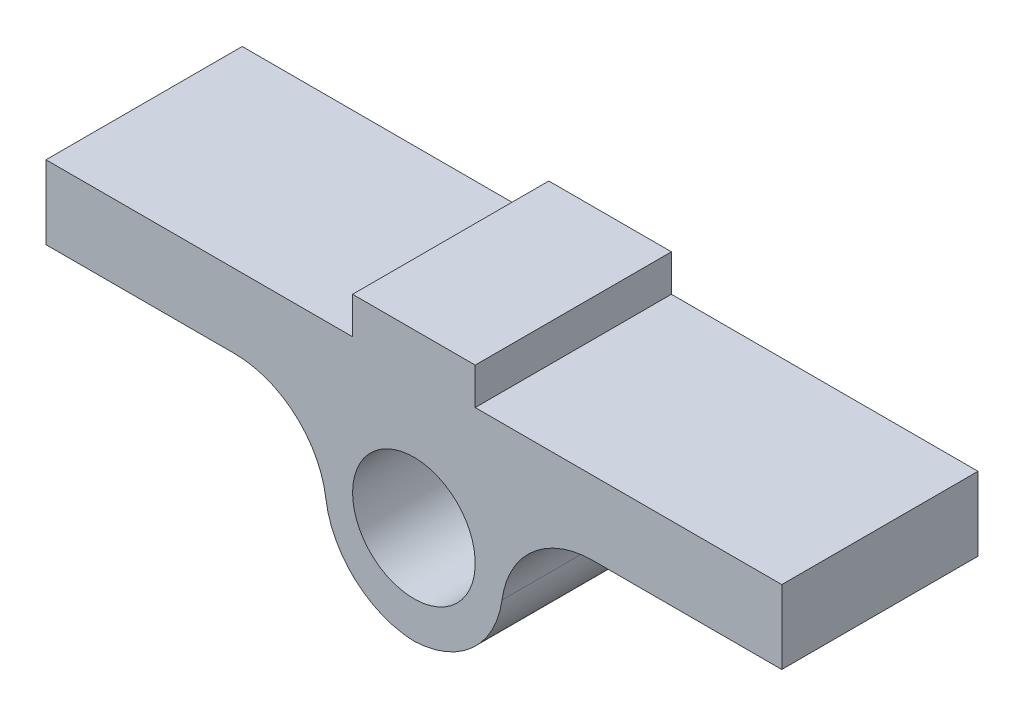
ISO-10303-21;
HEADER;
FILE_DESCRIPTION(('STEP AP214'),'2;1');
FILE_NAME('part.step','',(''),(''),'','','');
FILE_SCHEMA(('AUTOMOTIVE_DESIGN { 1 0 10303 214 1 1 1 1 }'));
ENDSEC;
DATA;
#1=APPLICATION_CONTEXT('core data for automotive mechanical design processes');
#2=APPLICATION_PROTOCOL_DEFINITION('international standard','automotive_design',2000,#1);
#3=PRODUCT_CONTEXT('',#1,'mechanical');
#4=PRODUCT('Part','Part','',(#3));
#5=PRODUCT_RELATED_PRODUCT_CATEGORY('part','',(#4));
#6=PRODUCT_DEFINITION_FORMATION('','',#4);
#7=PRODUCT_DEFINITION_CONTEXT('part definition',#1,'design');
#8=PRODUCT_DEFINITION('design','',#6,#7);
#9=PRODUCT_DEFINITION_SHAPE('','',#8);
#10=(LENGTH_UNIT() NAMED_UNIT(*) SI_UNIT(.MILLI.,.METRE.));
#11=(NAMED_UNIT(*) PLANE_ANGLE_UNIT() SI_UNIT($,.RADIAN.));
#12=(NAMED_UNIT(*) SI_UNIT($,.STERADIAN.) SOLID_ANGLE_UNIT());
#13=UNCERTAINTY_MEASURE_WITH_UNIT(LENGTH_MEASURE(1.E-05),#10,'distance_accuracy_value','');
#14=(GEOMETRIC_REPRESENTATION_CONTEXT(3) GLOBAL_UNCERTAINTY_ASSIGNED_CONTEXT((#13)) GLOBAL_UNIT_ASSIGNED_CONTEXT((#10,
#11,#12)) REPRESENTATION_CONTEXT('',''));
#15=CARTESIAN_POINT('',(0.,0.,0.));
#16=DIRECTION('',(0.,0.,1.));
#17=DIRECTION('',(1.,0.,0.));
#18=AXIS2_PLACEMENT_3D('',#15,#16,#17);
#19=CARTESIAN_POINT('',(0.,0.,0.));
#20=DIRECTION('',(0.,-1.,0.));
#21=DIRECTION('',(0.,0.,-1.));
#22=AXIS2_PLACEMENT_3D('',#19,#20,#21);
#23=PLANE('',#22);
#24=DIRECTION('',(-1.,0.,0.));
#25=VECTOR('',#24,1.);
#26=CARTESIAN_POINT('',(0.,0.,-16.));
#27=LINE('',#26,#25);
#28=CARTESIAN_POINT('',(15.3839312526815,0.,-16.));
#29=VERTEX_POINT('',#28);
#30=CARTESIAN_POINT('',(0.,0.,-16.));
#31=VERTEX_POINT('',#30);
#32=EDGE_CURVE('E182',#29,#31,#27,.T.);
#33=ORIENTED_EDGE('',*,*,#32,.F.);
#34=DIRECTION('',(0.,0.,-1.));
#35=VECTOR('',#34,1.);
#36=CARTESIAN_POINT('',(15.3839312526815,0.,0.));
#37=LINE('',#36,#35);
#38=CARTESIAN_POINT('',(15.3839312526815,0.,0.));
#39=VERTEX_POINT('',#38);
#40=EDGE_CURVE('E211',#29,#39,#37,.F.);
#41=ORIENTED_EDGE('',*,*,#40,.T.);
#42=DIRECTION('',(1.,0.,0.));
#43=VECTOR('',#42,1.);
#44=CARTESIAN_POINT('',(0.,0.,0.));
#45=LINE('',#44,#43);
#46=CARTESIAN_POINT('',(0.,0.,0.));
#47=VERTEX_POINT('',#46);
#48=EDGE_CURVE('E178',#47,#39,#45,.T.);
#49=ORIENTED_EDGE('',*,*,#48,.F.);
#50=DIRECTION('',(0.,0.,1.));
#51=VECTOR('',#50,1.);
#52=CARTESIAN_POINT('',(0.,0.,0.));
#53=LINE('',#52,#51);
#54=EDGE_CURVE('E156',#31,#47,#53,.T.);
#55=ORIENTED_EDGE('',*,*,#54,.F.);
#56=EDGE_LOOP('',(#33,#41,#49,#55));
#57=FACE_BOUND('',#56,.T.);
#58=ADVANCED_FACE('F37',(#57),#23,.T.);
#59=CARTESIAN_POINT('',(0.,6.,0.));
#60=DIRECTION('',(0.,-1.,0.));
#61=DIRECTION('',(0.,0.,-1.));
#62=AXIS2_PLACEMENT_3D('',#59,#60,#61);
#63=PLANE('',#62);
#64=DIRECTION('',(0.,0.,1.));
#65=VECTOR('',#64,1.);
#66=CARTESIAN_POINT('',(25.,6.,-16.));
#67=LINE('',#66,#65);
#68=CARTESIAN_POINT('',(25.,6.,-16.));
#69=VERTEX_POINT('',#68);
#70=CARTESIAN_POINT('',(25.,6.,0.));
#71=VERTEX_POINT('',#70);
#72=EDGE_CURVE('E155',#69,#71,#67,.T.);
#73=ORIENTED_EDGE('',*,*,#72,.F.);
#74=DIRECTION('',(-1.,0.,0.));
#75=VECTOR('',#74,1.);
#76=CARTESIAN_POINT('',(0.,6.,-16.));
#77=LINE('',#76,#75);
#78=CARTESIAN_POINT('',(0.,6.,-16.));
#79=VERTEX_POINT('',#78);
#80=EDGE_CURVE('E174',#69,#79,#77,.T.);
#81=ORIENTED_EDGE('',*,*,#80,.T.);
#82=DIRECTION('',(0.,0.,1.));
#83=VECTOR('',#82,1.);
#84=CARTESIAN_POINT('',(0.,6.,0.));
#85=LINE('',#84,#83);
#86=CARTESIAN_POINT('',(0.,6.,0.));
#87=VERTEX_POINT('',#86);
#88=EDGE_CURVE('E165',#79,#87,#85,.T.);
#89=ORIENTED_EDGE('',*,*,#88,.T.);
#90=DIRECTION('',(1.,0.,0.));
#91=VECTOR('',#90,1.);
#92=CARTESIAN_POINT('',(0.,6.,0.));
#93=LINE('',#92,#91);
#94=EDGE_CURVE('E170',#87,#71,#93,.T.);
#95=ORIENTED_EDGE('',*,*,#94,.T.);
#96=EDGE_LOOP('',(#73,#81,#89,#95));
#97=FACE_BOUND('',#96,.T.);
#98=ADVANCED_FACE('F278',(#97),#63,.F.);
#99=DIRECTION('',(0.,0.,-1.));
#100=VECTOR('',#99,1.);
#101=CARTESIAN_POINT('',(35.,6.,-16.));
#102=LINE('',#101,#100);
#103=CARTESIAN_POINT('',(35.,6.,0.));
#104=VERTEX_POINT('',#103);
#105=CARTESIAN_POINT('',(35.,6.,-16.));
#106=VERTEX_POINT('',#105);
#107=EDGE_CURVE('E152',#104,#106,#102,.T.);
#108=ORIENTED_EDGE('',*,*,#107,.F.);
#109=CARTESIAN_POINT('',(60.,6.,0.));
#110=VERTEX_POINT('',#109);
#111=EDGE_CURVE('E168',#104,#110,#93,.T.);
#112=ORIENTED_EDGE('',*,*,#111,.T.);
#113=DIRECTION('',(0.,0.,-1.));
#114=VECTOR('',#113,1.);
#115=CARTESIAN_POINT('',(60.,6.,0.));
#116=LINE('',#115,#114);
#117=CARTESIAN_POINT('',(60.,6.,-16.));
#118=VERTEX_POINT('',#117);
#119=EDGE_CURVE('E172',#110,#118,#116,.T.);
#120=ORIENTED_EDGE('',*,*,#119,.T.);
#121=EDGE_CURVE('E175',#118,#106,#77,.T.);
#122=ORIENTED_EDGE('',*,*,#121,.T.);
#123=EDGE_LOOP('',(#108,#112,#120,#122));
#124=FACE_BOUND('',#123,.T.);
#125=ADVANCED_FACE('F282',(#124),#63,.F.);
#126=CARTESIAN_POINT('',(0.,6.,0.));
#127=DIRECTION('',(1.,0.,0.));
#128=DIRECTION('',(0.,0.,-1.));
#129=AXIS2_PLACEMENT_3D('',#126,#127,#128);
#130=PLANE('',#129);
#131=ORIENTED_EDGE('',*,*,#54,.T.);
#132=DIRECTION('',(0.,-1.,0.));
#133=VECTOR('',#132,1.);
#134=CARTESIAN_POINT('',(0.,6.,0.));
#135=LINE('',#134,#133);
#136=EDGE_CURVE('E192',#87,#47,#135,.T.);
#137=ORIENTED_EDGE('',*,*,#136,.F.);
#138=ORIENTED_EDGE('',*,*,#88,.F.);
#139=DIRECTION('',(0.,-1.,0.));
#140=VECTOR('',#139,1.);
#141=CARTESIAN_POINT('',(0.,6.,-16.));
#142=LINE('',#141,#140);
#143=EDGE_CURVE('E176',#79,#31,#142,.T.);
#144=ORIENTED_EDGE('',*,*,#143,.T.);
#145=EDGE_LOOP('',(#131,#137,#138,#144));
#146=FACE_BOUND('',#145,.T.);
#147=ADVANCED_FACE('F239',(#146),#130,.F.);
#148=CARTESIAN_POINT('',(0.,6.,0.));
#149=DIRECTION('',(0.,0.,-1.));
#150=DIRECTION('',(-1.,0.,0.));
#151=AXIS2_PLACEMENT_3D('',#148,#149,#150);
#152=PLANE('',#151);
#153=CARTESIAN_POINT('',(30.,-5.,0.));
#154=DIRECTION('',(0.,0.,-1.));
#155=DIRECTION('',(-1.,0.,0.));
#156=AXIS2_PLACEMENT_3D('',#153,#154,#155);
#157=CIRCLE('',#156,5.);
#158=CARTESIAN_POINT('',(25.,-5.,0.));
#159=VERTEX_POINT('',#158);
#160=EDGE_CURVE('E250',#159,#159,#157,.T.);
#161=ORIENTED_EDGE('',*,*,#160,.T.);
#162=EDGE_LOOP('',(#161));
#163=FACE_BOUND('',#162,.T.);
#164=ORIENTED_EDGE('',*,*,#48,.T.);
#165=CARTESIAN_POINT('',(15.3839312526815,-7.5,0.));
#166=DIRECTION('',(0.,0.,-1.));
#167=DIRECTION('',(-1.,0.,0.));
#168=AXIS2_PLACEMENT_3D('',#165,#166,#167);
#169=CIRCLE('',#168,7.5);
#170=CARTESIAN_POINT('',(22.8169656263407,-6.5,0.));
#171=VERTEX_POINT('',#170);
#172=EDGE_CURVE('E219',#39,#171,#169,.T.);
#173=ORIENTED_EDGE('',*,*,#172,.T.);
#174=CARTESIAN_POINT('',(30.25,-5.5,0.));
#175=DIRECTION('',(0.,0.,-1.));
#176=DIRECTION('',(-1.,0.,0.));
#177=AXIS2_PLACEMENT_3D('',#174,#175,#176);
#178=CIRCLE('',#177,7.5);
#179=CARTESIAN_POINT('',(30.,-12.9958321752825,0.));
#180=VERTEX_POINT('',#179);
#181=EDGE_CURVE('E202',#171,#180,#178,.F.);
#182=ORIENTED_EDGE('',*,*,#181,.T.);
#183=CARTESIAN_POINT('',(29.75,-5.5,0.));
#184=DIRECTION('',(0.,0.,-1.));
#185=DIRECTION('',(-1.,0.,0.));
#186=AXIS2_PLACEMENT_3D('',#183,#184,#185);
#187=CIRCLE('',#186,7.5);
#188=CARTESIAN_POINT('',(37.1830343736593,-6.5,0.));
#189=VERTEX_POINT('',#188);
#190=EDGE_CURVE('E200',#180,#189,#187,.F.);
#191=ORIENTED_EDGE('',*,*,#190,.T.);
#192=CARTESIAN_POINT('',(44.6160687473185,-7.5,0.));
#193=DIRECTION('',(0.,0.,-1.));
#194=DIRECTION('',(-1.,0.,0.));
#195=AXIS2_PLACEMENT_3D('',#192,#193,#194);
#196=CIRCLE('',#195,7.5);
#197=CARTESIAN_POINT('',(44.6160687473185,0.,0.));
#198=VERTEX_POINT('',#197);
#199=EDGE_CURVE('E45',#189,#198,#196,.T.);
#200=ORIENTED_EDGE('',*,*,#199,.T.);
#201=CARTESIAN_POINT('',(60.,0.,0.));
#202=VERTEX_POINT('',#201);
#203=EDGE_CURVE('E159',#198,#202,#45,.T.);
#204=ORIENTED_EDGE('',*,*,#203,.T.);
#205=DIRECTION('',(0.,-1.,0.));
#206=VECTOR('',#205,1.);
#207=CARTESIAN_POINT('',(60.,6.,0.));
#208=LINE('',#207,#206);
#209=EDGE_CURVE('E189',#110,#202,#208,.T.);
#210=ORIENTED_EDGE('',*,*,#209,.F.);
#211=ORIENTED_EDGE('',*,*,#111,.F.);
#212=DIRECTION('',(0.,-1.,0.));
#213=VECTOR('',#212,1.);
#214=CARTESIAN_POINT('',(35.,9.,0.));
#215=LINE('',#214,#213);
#216=CARTESIAN_POINT('',(35.,9.,0.));
#217=VERTEX_POINT('',#216);
#218=EDGE_CURVE('E139',#217,#104,#215,.T.);
#219=ORIENTED_EDGE('',*,*,#218,.F.);
#220=DIRECTION('',(1.,0.,0.));
#221=VECTOR('',#220,1.);
#222=CARTESIAN_POINT('',(25.,9.,0.));
#223=LINE('',#222,#221);
#224=CARTESIAN_POINT('',(25.,9.,0.));
#225=VERTEX_POINT('',#224);
#226=EDGE_CURVE('E130',#225,#217,#223,.T.);
#227=ORIENTED_EDGE('',*,*,#226,.F.);
#228=DIRECTION('',(0.,-1.,0.));
#229=VECTOR('',#228,1.);
#230=CARTESIAN_POINT('',(25.,9.,0.));
#231=LINE('',#230,#229);
#232=EDGE_CURVE('E135',#225,#71,#231,.T.);
#233=ORIENTED_EDGE('',*,*,#232,.T.);
#234=ORIENTED_EDGE('',*,*,#94,.F.);
#235=ORIENTED_EDGE('',*,*,#136,.T.);
#236=EDGE_LOOP('',(#164,#173,#182,#191,#200,#204,#210,#211,#219,#227,#233,#234,#235));
#237=FACE_BOUND('',#236,.T.);
#238=ADVANCED_FACE('F133',(#163,#237),#152,.F.);
#239=CARTESIAN_POINT('',(60.,6.,0.));
#240=DIRECTION('',(-1.,0.,0.));
#241=DIRECTION('',(0.,0.,1.));
#242=AXIS2_PLACEMENT_3D('',#239,#240,#241);
#243=PLANE('',#242);
#244=DIRECTION('',(0.,0.,-1.));
#245=VECTOR('',#244,1.);
#246=CARTESIAN_POINT('',(60.,0.,0.));
#247=LINE('',#246,#245);
#248=CARTESIAN_POINT('',(60.,0.,-16.));
#249=VERTEX_POINT('',#248);
#250=EDGE_CURVE('E180',#202,#249,#247,.T.);
#251=ORIENTED_EDGE('',*,*,#250,.T.);
#252=DIRECTION('',(0.,-1.,0.));
#253=VECTOR('',#252,1.);
#254=CARTESIAN_POINT('',(60.,6.,-16.));
#255=LINE('',#254,#253);
#256=EDGE_CURVE('E186',#118,#249,#255,.T.);
#257=ORIENTED_EDGE('',*,*,#256,.F.);
#258=ORIENTED_EDGE('',*,*,#119,.F.);
#259=ORIENTED_EDGE('',*,*,#209,.T.);
#260=EDGE_LOOP('',(#251,#257,#258,#259));
#261=FACE_BOUND('',#260,.T.);
#262=ADVANCED_FACE('F268',(#261),#243,.F.);
#263=CARTESIAN_POINT('',(0.,6.,-16.));
#264=DIRECTION('',(0.,0.,1.));
#265=DIRECTION('',(1.,0.,0.));
#266=AXIS2_PLACEMENT_3D('',#263,#264,#265);
#267=PLANE('',#266);
#268=CARTESIAN_POINT('',(30.,-5.,-16.));
#269=DIRECTION('',(0.,0.,-1.));
#270=DIRECTION('',(-1.,0.,0.));
#271=AXIS2_PLACEMENT_3D('',#268,#269,#270);
#272=CIRCLE('',#271,5.);
#273=CARTESIAN_POINT('',(25.,-5.,-16.));
#274=VERTEX_POINT('',#273);
#275=EDGE_CURVE('E208',#274,#274,#272,.T.);
#276=ORIENTED_EDGE('',*,*,#275,.F.);
#277=EDGE_LOOP('',(#276));
#278=FACE_BOUND('',#277,.T.);
#279=CARTESIAN_POINT('',(44.6160687473185,0.,-16.));
#280=VERTEX_POINT('',#279);
#281=EDGE_CURVE('E169',#249,#280,#27,.T.);
#282=ORIENTED_EDGE('',*,*,#281,.T.);
#283=CARTESIAN_POINT('',(44.6160687473185,-7.5,-16.));
#284=DIRECTION('',(0.,0.,1.));
#285=DIRECTION('',(1.,0.,0.));
#286=AXIS2_PLACEMENT_3D('',#283,#284,#285);
#287=CIRCLE('',#286,7.5);
#288=CARTESIAN_POINT('',(37.1830343736593,-6.5,-16.));
#289=VERTEX_POINT('',#288);
#290=EDGE_CURVE('E11',#280,#289,#287,.T.);
#291=ORIENTED_EDGE('',*,*,#290,.T.);
#292=CARTESIAN_POINT('',(29.75,-5.5,-16.));
#293=DIRECTION('',(0.,0.,1.));
#294=DIRECTION('',(1.,0.,0.));
#295=AXIS2_PLACEMENT_3D('',#292,#293,#294);
#296=CIRCLE('',#295,7.5);
#297=CARTESIAN_POINT('',(30.,-12.9958321752825,-16.));
#298=VERTEX_POINT('',#297);
#299=EDGE_CURVE('E195',#289,#298,#296,.F.);
#300=ORIENTED_EDGE('',*,*,#299,.T.);
#301=CARTESIAN_POINT('',(30.25,-5.5,-16.));
#302=DIRECTION('',(0.,0.,1.));
#303=DIRECTION('',(1.,0.,0.));
#304=AXIS2_PLACEMENT_3D('',#301,#302,#303);
#305=CIRCLE('',#304,7.5);
#306=CARTESIAN_POINT('',(22.8169656263408,-6.5,-16.));
#307=VERTEX_POINT('',#306);
#308=EDGE_CURVE('E197',#298,#307,#305,.F.);
#309=ORIENTED_EDGE('',*,*,#308,.T.);
#310=CARTESIAN_POINT('',(15.3839312526815,-7.5,-16.));
#311=DIRECTION('',(0.,0.,1.));
#312=DIRECTION('',(1.,0.,0.));
#313=AXIS2_PLACEMENT_3D('',#310,#311,#312);
#314=CIRCLE('',#313,7.5);
#315=EDGE_CURVE('E217',#307,#29,#314,.T.);
#316=ORIENTED_EDGE('',*,*,#315,.T.);
#317=ORIENTED_EDGE('',*,*,#32,.T.);
#318=ORIENTED_EDGE('',*,*,#143,.F.);
#319=ORIENTED_EDGE('',*,*,#80,.F.);
#320=DIRECTION('',(0.,-1.,0.));
#321=VECTOR('',#320,1.);
#322=CARTESIAN_POINT('',(25.,9.,-16.));
#323=LINE('',#322,#321);
#324=CARTESIAN_POINT('',(25.,9.,-16.));
#325=VERTEX_POINT('',#324);
#326=EDGE_CURVE('E242',#325,#69,#323,.T.);
#327=ORIENTED_EDGE('',*,*,#326,.F.);
#328=DIRECTION('',(-1.,0.,0.));
#329=VECTOR('',#328,1.);
#330=CARTESIAN_POINT('',(25.,9.,-16.));
#331=LINE('',#330,#329);
#332=CARTESIAN_POINT('',(35.,9.,-16.));
#333=VERTEX_POINT('',#332);
#334=EDGE_CURVE('E148',#333,#325,#331,.T.);
#335=ORIENTED_EDGE('',*,*,#334,.F.);
#336=DIRECTION('',(0.,-1.,0.));
#337=VECTOR('',#336,1.);
#338=CARTESIAN_POINT('',(35.,9.,-16.));
#339=LINE('',#338,#337);
#340=EDGE_CURVE('E161',#333,#106,#339,.T.);
#341=ORIENTED_EDGE('',*,*,#340,.T.);
#342=ORIENTED_EDGE('',*,*,#121,.F.);
#343=ORIENTED_EDGE('',*,*,#256,.T.);
#344=EDGE_LOOP('',(#282,#291,#300,#309,#316,#317,#318,#319,#327,#335,#341,#342,#343));
#345=FACE_BOUND('',#344,.T.);
#346=ADVANCED_FACE('F233',(#278,#345),#267,.F.);
#347=ORIENTED_EDGE('',*,*,#203,.F.);
#348=DIRECTION('',(0.,0.,1.));
#349=VECTOR('',#348,1.);
#350=CARTESIAN_POINT('',(44.6160687473185,0.,-16.));
#351=LINE('',#350,#349);
#352=EDGE_CURVE('E58',#198,#280,#351,.F.);
#353=ORIENTED_EDGE('',*,*,#352,.T.);
#354=ORIENTED_EDGE('',*,*,#281,.F.);
#355=ORIENTED_EDGE('',*,*,#250,.F.);
#356=EDGE_LOOP('',(#347,#353,#354,#355));
#357=FACE_BOUND('',#356,.T.);
#358=ADVANCED_FACE('F267',(#357),#23,.T.);
#359=CARTESIAN_POINT('',(25.,9.,-16.));
#360=DIRECTION('',(1.,0.,0.));
#361=DIRECTION('',(0.,0.,-1.));
#362=AXIS2_PLACEMENT_3D('',#359,#360,#361);
#363=PLANE('',#362);
#364=ORIENTED_EDGE('',*,*,#72,.T.);
#365=ORIENTED_EDGE('',*,*,#232,.F.);
#366=DIRECTION('',(0.,0.,1.));
#367=VECTOR('',#366,1.);
#368=CARTESIAN_POINT('',(25.,9.,-16.));
#369=LINE('',#368,#367);
#370=EDGE_CURVE('E143',#325,#225,#369,.T.);
#371=ORIENTED_EDGE('',*,*,#370,.F.);
#372=ORIENTED_EDGE('',*,*,#326,.T.);
#373=EDGE_LOOP('',(#364,#365,#371,#372));
#374=FACE_BOUND('',#373,.T.);
#375=ADVANCED_FACE('F154',(#374),#363,.F.);
#376=CARTESIAN_POINT('',(35.,9.,-16.));
#377=DIRECTION('',(-1.,0.,0.));
#378=DIRECTION('',(0.,0.,1.));
#379=AXIS2_PLACEMENT_3D('',#376,#377,#378);
#380=PLANE('',#379);
#381=ORIENTED_EDGE('',*,*,#107,.T.);
#382=ORIENTED_EDGE('',*,*,#340,.F.);
#383=DIRECTION('',(0.,0.,-1.));
#384=VECTOR('',#383,1.);
#385=CARTESIAN_POINT('',(35.,9.,-16.));
#386=LINE('',#385,#384);
#387=EDGE_CURVE('E142',#217,#333,#386,.T.);
#388=ORIENTED_EDGE('',*,*,#387,.F.);
#389=ORIENTED_EDGE('',*,*,#218,.T.);
#390=EDGE_LOOP('',(#381,#382,#388,#389));
#391=FACE_BOUND('',#390,.T.);
#392=ADVANCED_FACE('F287',(#391),#380,.F.);
#393=CARTESIAN_POINT('',(0.,9.,0.));
#394=DIRECTION('',(0.,1.,0.));
#395=DIRECTION('',(0.,0.,1.));
#396=AXIS2_PLACEMENT_3D('',#393,#394,#395);
#397=PLANE('',#396);
#398=ORIENTED_EDGE('',*,*,#370,.T.);
#399=ORIENTED_EDGE('',*,*,#226,.T.);
#400=ORIENTED_EDGE('',*,*,#387,.T.);
#401=ORIENTED_EDGE('',*,*,#334,.T.);
#402=EDGE_LOOP('',(#398,#399,#400,#401));
#403=FACE_BOUND('',#402,.T.);
#404=ADVANCED_FACE('F146',(#403),#397,.T.);
#405=CARTESIAN_POINT('',(30.,-5.,0.));
#406=DIRECTION('',(0.,0.,-1.));
#407=DIRECTION('',(-1.,0.,0.));
#408=AXIS2_PLACEMENT_3D('',#405,#406,#407);
#409=CYLINDRICAL_SURFACE('',#408,5.);
#410=ORIENTED_EDGE('',*,*,#160,.F.);
#411=EDGE_LOOP('',(#410));
#412=FACE_BOUND('',#411,.T.);
#413=ORIENTED_EDGE('',*,*,#275,.T.);
#414=EDGE_LOOP('',(#413));
#415=FACE_BOUND('',#414,.T.);
#416=ADVANCED_FACE('F259',(#412,#415),#409,.F.);
#417=CARTESIAN_POINT('',(29.75,-5.5,0.));
#418=DIRECTION('',(0.,0.,-1.));
#419=DIRECTION('',(-1.,0.,0.));
#420=AXIS2_PLACEMENT_3D('',#417,#418,#419);
#421=CYLINDRICAL_SURFACE('',#420,7.5);
#422=ORIENTED_EDGE('',*,*,#299,.F.);
#423=DIRECTION('',(0.,0.,-1.));
#424=VECTOR('',#423,1.);
#425=CARTESIAN_POINT('',(37.1830343736593,-6.5,0.));
#426=LINE('',#425,#424);
#427=EDGE_CURVE('E213',#289,#189,#426,.F.);
#428=ORIENTED_EDGE('',*,*,#427,.T.);
#429=ORIENTED_EDGE('',*,*,#190,.F.);
#430=DIRECTION('',(0.,0.,-1.));
#431=VECTOR('',#430,1.);
#432=CARTESIAN_POINT('',(30.,-12.9958321752825,-8.));
#433=LINE('',#432,#431);
#434=EDGE_CURVE('E205',#298,#180,#433,.F.);
#435=ORIENTED_EDGE('',*,*,#434,.F.);
#436=EDGE_LOOP('',(#422,#428,#429,#435));
#437=FACE_BOUND('',#436,.T.);
#438=ADVANCED_FACE('F262',(#437),#421,.T.);
#439=CARTESIAN_POINT('',(30.25,-5.5,0.));
#440=DIRECTION('',(0.,0.,1.));
#441=DIRECTION('',(1.,0.,0.));
#442=AXIS2_PLACEMENT_3D('',#439,#440,#441);
#443=CYLINDRICAL_SURFACE('',#442,7.5);
#444=ORIENTED_EDGE('',*,*,#181,.F.);
#445=DIRECTION('',(0.,0.,1.));
#446=VECTOR('',#445,1.);
#447=CARTESIAN_POINT('',(22.8169656263407,-6.5,0.));
#448=LINE('',#447,#446);
#449=EDGE_CURVE('E204',#171,#307,#448,.F.);
#450=ORIENTED_EDGE('',*,*,#449,.T.);
#451=ORIENTED_EDGE('',*,*,#308,.F.);
#452=ORIENTED_EDGE('',*,*,#434,.T.);
#453=EDGE_LOOP('',(#444,#450,#451,#452));
#454=FACE_BOUND('',#453,.T.);
#455=ADVANCED_FACE('F227',(#454),#443,.T.);
#456=CARTESIAN_POINT('',(15.3839312526815,-7.5,0.));
#457=DIRECTION('',(0.,0.,1.));
#458=DIRECTION('',(1.,0.,0.));
#459=AXIS2_PLACEMENT_3D('',#456,#457,#458);
#460=CYLINDRICAL_SURFACE('',#459,7.5);
#461=ORIENTED_EDGE('',*,*,#172,.F.);
#462=ORIENTED_EDGE('',*,*,#40,.F.);
#463=ORIENTED_EDGE('',*,*,#315,.F.);
#464=ORIENTED_EDGE('',*,*,#449,.F.);
#465=EDGE_LOOP('',(#461,#462,#463,#464));
#466=FACE_BOUND('',#465,.T.);
#467=ADVANCED_FACE('F230',(#466),#460,.F.);
#468=CARTESIAN_POINT('',(44.6160687473185,-7.5,0.));
#469=DIRECTION('',(0.,0.,-1.));
#470=DIRECTION('',(-1.,0.,0.));
#471=AXIS2_PLACEMENT_3D('',#468,#469,#470);
#472=CYLINDRICAL_SURFACE('',#471,7.5);
#473=ORIENTED_EDGE('',*,*,#290,.F.);
#474=ORIENTED_EDGE('',*,*,#352,.F.);
#475=ORIENTED_EDGE('',*,*,#199,.F.);
#476=ORIENTED_EDGE('',*,*,#427,.F.);
#477=EDGE_LOOP('',(#473,#474,#475,#476));
#478=FACE_BOUND('',#477,.T.);
#479=ADVANCED_FACE('F39',(#478),#472,.F.);
#480=CLOSED_SHELL('',(#58,#98,#125,#147,#238,#262,#346,#358,#375,#392,#404,#416,#438,#455,#467,#479));
#481=MANIFOLD_SOLID_BREP('B2',#480);
#482=ADVANCED_BREP_SHAPE_REPRESENTATION('',(#18,#481),#14);
#483=SHAPE_DEFINITION_REPRESENTATION(#9,#482);
ENDSEC;
END-ISO-10303-21;
